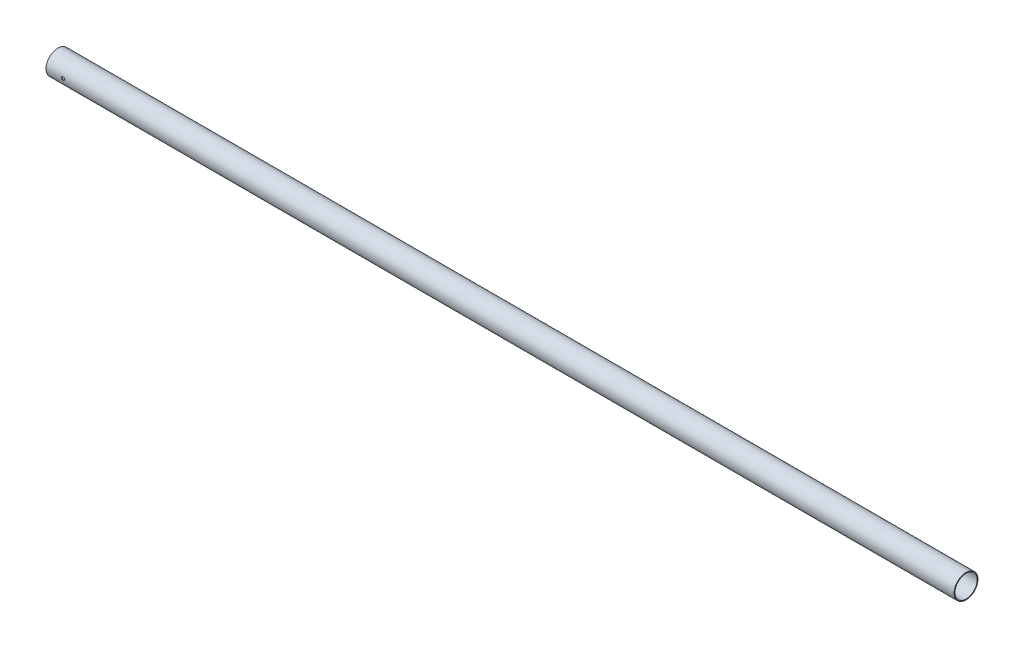
ISO-10303-21;
HEADER;
FILE_DESCRIPTION(('STEP AP214'),'2;1');
FILE_NAME('part.step','',(''),(''),'','','');
FILE_SCHEMA(('AUTOMOTIVE_DESIGN { 1 0 10303 214 1 1 1 1 }'));
ENDSEC;
DATA;
#1=APPLICATION_CONTEXT('core data for automotive mechanical design processes');
#2=APPLICATION_PROTOCOL_DEFINITION('international standard','automotive_design',2000,#1);
#3=PRODUCT_CONTEXT('',#1,'mechanical');
#4=PRODUCT('Part','Part','',(#3));
#5=PRODUCT_RELATED_PRODUCT_CATEGORY('part','',(#4));
#6=PRODUCT_DEFINITION_FORMATION('','',#4);
#7=PRODUCT_DEFINITION_CONTEXT('part definition',#1,'design');
#8=PRODUCT_DEFINITION('design','',#6,#7);
#9=PRODUCT_DEFINITION_SHAPE('','',#8);
#10=(LENGTH_UNIT() NAMED_UNIT(*) SI_UNIT(.MILLI.,.METRE.));
#11=(NAMED_UNIT(*) PLANE_ANGLE_UNIT() SI_UNIT($,.RADIAN.));
#12=(NAMED_UNIT(*) SI_UNIT($,.STERADIAN.) SOLID_ANGLE_UNIT());
#13=UNCERTAINTY_MEASURE_WITH_UNIT(LENGTH_MEASURE(1.E-05),#10,'distance_accuracy_value','');
#14=(GEOMETRIC_REPRESENTATION_CONTEXT(3) GLOBAL_UNCERTAINTY_ASSIGNED_CONTEXT((#13)) GLOBAL_UNIT_ASSIGNED_CONTEXT((#10,
#11,#12)) REPRESENTATION_CONTEXT('',''));
#15=CARTESIAN_POINT('',(0.,0.,0.));
#16=DIRECTION('',(0.,0.,1.));
#17=DIRECTION('',(1.,0.,0.));
#18=AXIS2_PLACEMENT_3D('',#15,#16,#17);
#19=CARTESIAN_POINT('',(965.67,0.,0.));
#20=DIRECTION('',(1.,0.,0.));
#21=DIRECTION('',(0.,0.,-1.));
#22=AXIS2_PLACEMENT_3D('',#19,#20,#21);
#23=PLANE('',#22);
#24=CARTESIAN_POINT('',(965.67,0.,0.));
#25=DIRECTION('',(1.,0.,0.));
#26=DIRECTION('',(0.,0.,-1.));
#27=AXIS2_PLACEMENT_3D('',#24,#25,#26);
#28=CIRCLE('',#27,12.7);
#29=CARTESIAN_POINT('',(965.67,0.,-12.7));
#30=VERTEX_POINT('',#29);
#31=EDGE_CURVE('E10',#30,#30,#28,.T.);
#32=ORIENTED_EDGE('',*,*,#31,.T.);
#33=EDGE_LOOP('',(#32));
#34=FACE_BOUND('',#33,.T.);
#35=CARTESIAN_POINT('',(965.67,0.,0.));
#36=DIRECTION('',(1.,0.,0.));
#37=DIRECTION('',(0.,0.,-1.));
#38=AXIS2_PLACEMENT_3D('',#35,#36,#37);
#39=CIRCLE('',#38,11.811);
#40=CARTESIAN_POINT('',(965.67,0.,-11.811));
#41=VERTEX_POINT('',#40);
#42=EDGE_CURVE('E56',#41,#41,#39,.T.);
#43=ORIENTED_EDGE('',*,*,#42,.F.);
#44=EDGE_LOOP('',(#43));
#45=FACE_BOUND('',#44,.T.);
#46=ADVANCED_FACE('F37',(#34,#45),#23,.T.);
#47=CARTESIAN_POINT('',(0.,0.,0.));
#48=DIRECTION('',(1.,0.,0.));
#49=DIRECTION('',(0.,0.,-1.));
#50=AXIS2_PLACEMENT_3D('',#47,#48,#49);
#51=PLANE('',#50);
#52=CARTESIAN_POINT('',(0.,0.,0.));
#53=DIRECTION('',(1.,0.,0.));
#54=DIRECTION('',(0.,0.,-1.));
#55=AXIS2_PLACEMENT_3D('',#52,#53,#54);
#56=CIRCLE('',#55,12.7);
#57=CARTESIAN_POINT('',(0.,0.,-12.7));
#58=VERTEX_POINT('',#57);
#59=EDGE_CURVE('E51',#58,#58,#56,.T.);
#60=ORIENTED_EDGE('',*,*,#59,.F.);
#61=EDGE_LOOP('',(#60));
#62=FACE_BOUND('',#61,.T.);
#63=CARTESIAN_POINT('',(0.,0.,0.));
#64=DIRECTION('',(1.,0.,0.));
#65=DIRECTION('',(0.,0.,-1.));
#66=AXIS2_PLACEMENT_3D('',#63,#64,#65);
#67=CIRCLE('',#66,11.811);
#68=CARTESIAN_POINT('',(0.,0.,-11.811));
#69=VERTEX_POINT('',#68);
#70=EDGE_CURVE('E59',#69,#69,#67,.T.);
#71=ORIENTED_EDGE('',*,*,#70,.T.);
#72=EDGE_LOOP('',(#71));
#73=FACE_BOUND('',#72,.T.);
#74=ADVANCED_FACE('F95',(#62,#73),#51,.F.);
#75=CARTESIAN_POINT('',(965.67,0.,0.));
#76=DIRECTION('',(-1.,0.,0.));
#77=DIRECTION('',(0.,0.,1.));
#78=AXIS2_PLACEMENT_3D('',#75,#76,#77);
#79=CYLINDRICAL_SURFACE('',#78,12.7);
#80=CARTESIAN_POINT('',(19.7,0.,-12.7));
#81=CARTESIAN_POINT('',(19.6999959992179,0.0950339668840666,-12.6999985995786));
#82=CARTESIAN_POINT('',(19.6920041882555,0.19012590693117,-12.69892205577));
#83=CARTESIAN_POINT('',(19.6602516928035,0.377659735515664,-12.6947310786922));
#84=CARTESIAN_POINT('',(19.6364749137547,0.470098818704447,-12.6916145654891));
#85=CARTESIAN_POINT('',(19.5738689603469,0.649585162895937,-12.6836944529743));
#86=CARTESIAN_POINT('',(19.5350503362114,0.736636153540407,-12.6788920363625));
#87=CARTESIAN_POINT('',(19.4434866282167,0.902972809326937,-12.668133083874));
#88=CARTESIAN_POINT('',(19.3907437804094,0.98225971848077,-12.6621767333452));
#89=CARTESIAN_POINT('',(19.2724752538047,1.13133074623819,-12.6497322350832));
#90=CARTESIAN_POINT('',(19.2068795471188,1.20105907920494,-12.6432412923369));
#91=CARTESIAN_POINT('',(19.0649178381758,1.32855287527093,-12.6304814917944));
#92=CARTESIAN_POINT('',(18.9885512647912,1.38631770360164,-12.6242126457971));
#93=CARTESIAN_POINT('',(18.8268487301552,1.48845585085959,-12.6125794864754));
#94=CARTESIAN_POINT('',(18.7414790965265,1.53277630674079,-12.6072187794791));
#95=CARTESIAN_POINT('',(18.5644244545483,1.60642994888796,-12.5980462279763));
#96=CARTESIAN_POINT('',(18.4727397204773,1.63576378559042,-12.5942343162519));
#97=CARTESIAN_POINT('',(18.2862392993217,1.67844067068208,-12.5886179602665));
#98=CARTESIAN_POINT('',(18.19144564102,1.69187839487359,-12.5868016351371));
#99=CARTESIAN_POINT('',(18.0009326732876,1.70267468090193,-12.5853458584028));
#100=CARTESIAN_POINT('',(17.9052134065726,1.70003398123825,-12.5857063068164));
#101=CARTESIAN_POINT('',(17.7162291334578,1.67882597900675,-12.5885524791077));
#102=CARTESIAN_POINT('',(17.6229521402506,1.66036334859318,-12.591024234991));
#103=CARTESIAN_POINT('',(17.4408322087313,1.60819906549934,-12.5977927233188));
#104=CARTESIAN_POINT('',(17.3519893722998,1.57449706285331,-12.6020894976741));
#105=CARTESIAN_POINT('',(17.180936742358,1.4926994268841,-12.6120395901206));
#106=CARTESIAN_POINT('',(17.0987487727502,1.44455869286377,-12.6176971476118));
#107=CARTESIAN_POINT('',(16.9435781710446,1.33528234667655,-12.6297281429156));
#108=CARTESIAN_POINT('',(16.8705960216702,1.27414605351568,-12.6361016182354));
#109=CARTESIAN_POINT('',(16.7353015027677,1.14003577368446,-12.6489082931571));
#110=CARTESIAN_POINT('',(16.673078463414,1.06697163981454,-12.655341565124));
#111=CARTESIAN_POINT('',(16.5617652939802,0.911389033566232,-12.6674957373912));
#112=CARTESIAN_POINT('',(16.5126752022542,0.828870533577836,-12.6732166356108));
#113=CARTESIAN_POINT('',(16.4290198450538,0.656649852468908,-12.6833057832175));
#114=CARTESIAN_POINT('',(16.3944606061958,0.566944709042034,-12.6876734711684));
#115=CARTESIAN_POINT('',(16.3409211232213,0.382932939657379,-12.6945591425037));
#116=CARTESIAN_POINT('',(16.3219400419676,0.288626561248753,-12.6970772252812));
#117=CARTESIAN_POINT('',(16.3002124588233,0.0988612499416711,-12.6999669678248));
#118=CARTESIAN_POINT('',(16.2973429834856,0.00341663518550021,-12.7003548857848));
#119=CARTESIAN_POINT('',(16.3075949092041,-0.186592199942903,-12.6989846078418));
#120=CARTESIAN_POINT('',(16.3207159184645,-0.281156441828657,-12.6972264645213));
#121=CARTESIAN_POINT('',(16.3624741566565,-0.466354124240493,-12.6917717046385));
#122=CARTESIAN_POINT('',(16.3910523228938,-0.557001118115943,-12.688082468612));
#123=CARTESIAN_POINT('',(16.4628519475053,-0.73221634230603,-12.6791782889493));
#124=CARTESIAN_POINT('',(16.5060739685466,-0.816784338893335,-12.6739632866891));
#125=CARTESIAN_POINT('',(16.6062288937945,-0.977987387725022,-12.6625478144558));
#126=CARTESIAN_POINT('',(16.6632408321252,-1.05457293223038,-12.6563417366426));
#127=CARTESIAN_POINT('',(16.7892460195627,-1.19713236803618,-12.6436547701942));
#128=CARTESIAN_POINT('',(16.8582398170769,-1.26310577335476,-12.6371738689908));
#129=CARTESIAN_POINT('',(17.006793907203,-1.38300824178855,-12.6246170593813));
#130=CARTESIAN_POINT('',(17.0864205322927,-1.43685547455966,-12.6185440858799));
#131=CARTESIAN_POINT('',(17.2536601808562,-1.53041060066335,-12.607540272347));
#132=CARTESIAN_POINT('',(17.3412730247706,-1.57011881179429,-12.6026094066456));
#133=CARTESIAN_POINT('',(17.5217407781579,-1.63413811770883,-12.5944685488549));
#134=CARTESIAN_POINT('',(17.6145794495971,-1.65849431867464,-12.5912535197242));
#135=CARTESIAN_POINT('',(17.8030751011367,-1.69126295280576,-12.5868942723901));
#136=CARTESIAN_POINT('',(17.8987319289187,-1.69967624606926,-12.5857499424755));
#137=CARTESIAN_POINT('',(18.0893339863174,-1.70030289341542,-12.5856652315807));
#138=CARTESIAN_POINT('',(18.1842788108431,-1.69264483293011,-12.5867073569543));
#139=CARTESIAN_POINT('',(18.3715183834309,-1.66161953930401,-12.5908403897388));
#140=CARTESIAN_POINT('',(18.463813132574,-1.6382523125708,-12.593931296314));
#141=CARTESIAN_POINT('',(18.6431094231047,-1.57651400196732,-12.601807977421));
#142=CARTESIAN_POINT('',(18.7301134601321,-1.53815005652329,-12.6065929454788));
#143=CARTESIAN_POINT('',(18.8964702488958,-1.44751995832389,-12.6173198076024));
#144=CARTESIAN_POINT('',(18.9758228494986,-1.39525353103899,-12.6232617245136));
#145=CARTESIAN_POINT('',(19.1252803268485,-1.27782820548912,-12.6356898389152));
#146=CARTESIAN_POINT('',(19.1953097247303,-1.21257363471889,-12.6421798563099));
#147=CARTESIAN_POINT('',(19.3234721297044,-1.07122538659935,-12.6549397826002));
#148=CARTESIAN_POINT('',(19.3816023430478,-0.995129170891949,-12.6612096395197));
#149=CARTESIAN_POINT('',(19.48453599194,-0.833873629090083,-12.6728533752327));
#150=CARTESIAN_POINT('',(19.5292802962862,-0.748676282109283,-12.6782232337741));
#151=CARTESIAN_POINT('',(19.6037608892282,-0.571949691102355,-12.6874217828558));
#152=CARTESIAN_POINT('',(19.63351323197,-0.48042734019212,-12.6912521210983));
#153=CARTESIAN_POINT('',(19.6701668573837,-0.32370968364222,-12.6960329483211));
#154=CARTESIAN_POINT('',(19.6813378724772,-0.259496143043121,-12.6975132154494));
#155=CARTESIAN_POINT('',(19.6962557812401,-0.130197467850004,-12.6994972166818));
#156=CARTESIAN_POINT('',(19.7000027411282,-0.0651123410353023,-12.700000959496));
#157=CARTESIAN_POINT('',(19.7,0.,-12.7));
#158=B_SPLINE_CURVE_WITH_KNOTS('',3,(#80,#81,#82,#83,#84,#85,#86,#87,#88,#89,#90,#91,#92,#93,
#94,#95,#96,#97,#98,#99,#100,#101,#102,#103,#104,#105,#106,#107,#108,#109,#110,#111,#112,#113,
#114,#115,#116,#117,#118,#119,#120,#121,#122,#123,#124,#125,#126,#127,#128,#129,#130,#131,#132,
#133,#134,#135,#136,#137,#138,#139,#140,#141,#142,#143,#144,#145,#146,#147,#148,#149,#150,#151,
#152,#153,#154,#155,#156,#157),.UNSPECIFIED.,.T.,.F.,(4,2,2,2,2,2,2,2,2,2,2,2,2,2,2,2,2,2,2,2,2,
2,2,2,2,2,2,2,2,2,2,2,2,2,2,2,2,2,4),(0.,0.284864035698537,0.570018969485685,0.854974258980744,
1.13988381611715,1.42639115813427,1.71291369797885,2.00054865692536,2.28817113112365,
2.57407178612564,2.85995930949888,3.14396997780514,3.42798716862777,3.71290091962872,
3.99782960437716,4.28502088941334,4.57221301316844,4.85952413156251,5.14681980945722,
5.43191966224501,5.71701252971187,6.00102365831222,6.28504570083371,6.57073582475008,
6.8564390280948,7.14401601038438,7.431586528488,7.71830813986012,8.0050142825509,
8.28943526420126,8.57385612983972,8.85814177590334,9.14243303611576,9.42890156631939,
9.71543727805735,10.0032206578249,10.290695206261,10.4858709975236,10.6810450479105),.UNSPECIFIED.);
#159=CARTESIAN_POINT('',(19.7,0.,-12.7));
#160=VERTEX_POINT('',#159);
#161=EDGE_CURVE('E84',#160,#160,#158,.T.);
#162=ORIENTED_EDGE('',*,*,#161,.T.);
#163=EDGE_LOOP('',(#162));
#164=FACE_BOUND('',#163,.T.);
#165=CARTESIAN_POINT('',(19.7,0.,12.7));
#166=CARTESIAN_POINT('',(19.6999959992179,-0.0950339668840666,12.6999985995786));
#167=CARTESIAN_POINT('',(19.6920041882555,-0.19012590693117,12.69892205577));
#168=CARTESIAN_POINT('',(19.6602516928035,-0.377659735515664,12.6947310786922));
#169=CARTESIAN_POINT('',(19.6364749137547,-0.470098818704447,12.6916145654891));
#170=CARTESIAN_POINT('',(19.5738689603469,-0.649585162895937,12.6836944529743));
#171=CARTESIAN_POINT('',(19.5350503362114,-0.736636153540407,12.6788920363625));
#172=CARTESIAN_POINT('',(19.4434866282167,-0.902972809326937,12.668133083874));
#173=CARTESIAN_POINT('',(19.3907437804094,-0.98225971848077,12.6621767333452));
#174=CARTESIAN_POINT('',(19.2724752538047,-1.13133074623819,12.6497322350832));
#175=CARTESIAN_POINT('',(19.2068795471188,-1.20105907920494,12.6432412923369));
#176=CARTESIAN_POINT('',(19.0649178381758,-1.32855287527093,12.6304814917944));
#177=CARTESIAN_POINT('',(18.9885512647912,-1.38631770360164,12.6242126457971));
#178=CARTESIAN_POINT('',(18.8268487301552,-1.48845585085959,12.6125794864754));
#179=CARTESIAN_POINT('',(18.7414790965265,-1.53277630674079,12.6072187794791));
#180=CARTESIAN_POINT('',(18.5644244545483,-1.60642994888796,12.5980462279763));
#181=CARTESIAN_POINT('',(18.4727397204773,-1.63576378559042,12.5942343162519));
#182=CARTESIAN_POINT('',(18.2862392993217,-1.67844067068208,12.5886179602665));
#183=CARTESIAN_POINT('',(18.19144564102,-1.69187839487359,12.5868016351371));
#184=CARTESIAN_POINT('',(18.0009326732876,-1.70267468090193,12.5853458584028));
#185=CARTESIAN_POINT('',(17.9052134065726,-1.70003398123825,12.5857063068164));
#186=CARTESIAN_POINT('',(17.7162291334578,-1.67882597900675,12.5885524791077));
#187=CARTESIAN_POINT('',(17.6229521402506,-1.66036334859318,12.591024234991));
#188=CARTESIAN_POINT('',(17.4408322087313,-1.60819906549934,12.5977927233188));
#189=CARTESIAN_POINT('',(17.3519893722998,-1.57449706285331,12.6020894976741));
#190=CARTESIAN_POINT('',(17.180936742358,-1.4926994268841,12.6120395901206));
#191=CARTESIAN_POINT('',(17.0987487727502,-1.44455869286377,12.6176971476118));
#192=CARTESIAN_POINT('',(16.9435781710446,-1.33528234667655,12.6297281429156));
#193=CARTESIAN_POINT('',(16.8705960216702,-1.27414605351568,12.6361016182354));
#194=CARTESIAN_POINT('',(16.7353015027677,-1.14003577368446,12.6489082931571));
#195=CARTESIAN_POINT('',(16.673078463414,-1.06697163981454,12.655341565124));
#196=CARTESIAN_POINT('',(16.5617652939802,-0.911389033566232,12.6674957373912));
#197=CARTESIAN_POINT('',(16.5126752022542,-0.828870533577836,12.6732166356108));
#198=CARTESIAN_POINT('',(16.4290198450538,-0.656649852468908,12.6833057832175));
#199=CARTESIAN_POINT('',(16.3944606061958,-0.566944709042034,12.6876734711684));
#200=CARTESIAN_POINT('',(16.3409211232213,-0.382932939657379,12.6945591425037));
#201=CARTESIAN_POINT('',(16.3219400419676,-0.288626561248753,12.6970772252812));
#202=CARTESIAN_POINT('',(16.3002124588233,-0.0988612499416711,12.6999669678248));
#203=CARTESIAN_POINT('',(16.2973429834856,-0.00341663518550021,12.7003548857848));
#204=CARTESIAN_POINT('',(16.3075949092041,0.186592199942903,12.6989846078418));
#205=CARTESIAN_POINT('',(16.3207159184645,0.281156441828657,12.6972264645213));
#206=CARTESIAN_POINT('',(16.3624741566565,0.466354124240493,12.6917717046385));
#207=CARTESIAN_POINT('',(16.3910523228938,0.557001118115943,12.688082468612));
#208=CARTESIAN_POINT('',(16.4628519475053,0.73221634230603,12.6791782889493));
#209=CARTESIAN_POINT('',(16.5060739685466,0.816784338893335,12.6739632866891));
#210=CARTESIAN_POINT('',(16.6062288937945,0.977987387725022,12.6625478144558));
#211=CARTESIAN_POINT('',(16.6632408321252,1.05457293223038,12.6563417366426));
#212=CARTESIAN_POINT('',(16.7892460195627,1.19713236803618,12.6436547701942));
#213=CARTESIAN_POINT('',(16.8582398170769,1.26310577335476,12.6371738689908));
#214=CARTESIAN_POINT('',(17.006793907203,1.38300824178855,12.6246170593813));
#215=CARTESIAN_POINT('',(17.0864205322927,1.43685547455966,12.6185440858799));
#216=CARTESIAN_POINT('',(17.2536601808562,1.53041060066335,12.607540272347));
#217=CARTESIAN_POINT('',(17.3412730247706,1.57011881179429,12.6026094066456));
#218=CARTESIAN_POINT('',(17.5217407781579,1.63413811770883,12.5944685488549));
#219=CARTESIAN_POINT('',(17.6145794495971,1.65849431867464,12.5912535197242));
#220=CARTESIAN_POINT('',(17.8030751011367,1.69126295280576,12.5868942723901));
#221=CARTESIAN_POINT('',(17.8987319289187,1.69967624606926,12.5857499424755));
#222=CARTESIAN_POINT('',(18.0893339863174,1.70030289341542,12.5856652315807));
#223=CARTESIAN_POINT('',(18.1842788108431,1.69264483293011,12.5867073569543));
#224=CARTESIAN_POINT('',(18.3715183834309,1.66161953930401,12.5908403897388));
#225=CARTESIAN_POINT('',(18.463813132574,1.6382523125708,12.593931296314));
#226=CARTESIAN_POINT('',(18.6431094231047,1.57651400196732,12.601807977421));
#227=CARTESIAN_POINT('',(18.7301134601321,1.53815005652329,12.6065929454788));
#228=CARTESIAN_POINT('',(18.8964702488958,1.44751995832389,12.6173198076024));
#229=CARTESIAN_POINT('',(18.9758228494986,1.39525353103899,12.6232617245136));
#230=CARTESIAN_POINT('',(19.1252803268485,1.27782820548912,12.6356898389152));
#231=CARTESIAN_POINT('',(19.1953097247303,1.21257363471889,12.6421798563099));
#232=CARTESIAN_POINT('',(19.3234721297044,1.07122538659935,12.6549397826002));
#233=CARTESIAN_POINT('',(19.3816023430478,0.995129170891949,12.6612096395197));
#234=CARTESIAN_POINT('',(19.48453599194,0.833873629090083,12.6728533752327));
#235=CARTESIAN_POINT('',(19.5292802962862,0.748676282109283,12.6782232337741));
#236=CARTESIAN_POINT('',(19.6037608892282,0.571949691102355,12.6874217828558));
#237=CARTESIAN_POINT('',(19.63351323197,0.48042734019212,12.6912521210983));
#238=CARTESIAN_POINT('',(19.6701668573837,0.32370968364222,12.6960329483211));
#239=CARTESIAN_POINT('',(19.6813378724772,0.259496143043121,12.6975132154494));
#240=CARTESIAN_POINT('',(19.6962557812401,0.130197467850004,12.6994972166818));
#241=CARTESIAN_POINT('',(19.7000027411282,0.0651123410353023,12.700000959496));
#242=CARTESIAN_POINT('',(19.7,0.,12.7));
#243=B_SPLINE_CURVE_WITH_KNOTS('',3,(#165,#166,#167,#168,#169,#170,#171,#172,#173,#174,#175,
#176,#177,#178,#179,#180,#181,#182,#183,#184,#185,#186,#187,#188,#189,#190,#191,#192,#193,#194,
#195,#196,#197,#198,#199,#200,#201,#202,#203,#204,#205,#206,#207,#208,#209,#210,#211,#212,#213,
#214,#215,#216,#217,#218,#219,#220,#221,#222,#223,#224,#225,#226,#227,#228,#229,#230,#231,#232,
#233,#234,#235,#236,#237,#238,#239,#240,#241,#242),.UNSPECIFIED.,.T.,.F.,(4,2,2,2,2,2,2,2,2,2,2,
2,2,2,2,2,2,2,2,2,2,2,2,2,2,2,2,2,2,2,2,2,2,2,2,2,2,2,4),(0.,0.284864035698537,
0.570018969485685,0.854974258980744,1.13988381611715,1.42639115813427,1.71291369797885,
2.00054865692536,2.28817113112365,2.57407178612564,2.85995930949888,3.14396997780514,
3.42798716862777,3.71290091962872,3.99782960437716,4.28502088941334,4.57221301316844,
4.85952413156251,5.14681980945722,5.43191966224501,5.71701252971187,6.00102365831222,
6.28504570083371,6.57073582475008,6.8564390280948,7.14401601038438,7.431586528488,
7.71830813986012,8.0050142825509,8.28943526420126,8.57385612983972,8.85814177590334,
9.14243303611576,9.42890156631939,9.71543727805735,10.0032206578249,10.290695206261,
10.4858709975236,10.6810450479105),.UNSPECIFIED.);
#244=CARTESIAN_POINT('',(19.7,0.,12.7));
#245=VERTEX_POINT('',#244);
#246=EDGE_CURVE('E79',#245,#245,#243,.T.);
#247=ORIENTED_EDGE('',*,*,#246,.T.);
#248=EDGE_LOOP('',(#247));
#249=FACE_BOUND('',#248,.T.);
#250=ORIENTED_EDGE('',*,*,#31,.F.);
#251=EDGE_LOOP('',(#250));
#252=FACE_BOUND('',#251,.T.);
#253=ORIENTED_EDGE('',*,*,#59,.T.);
#254=EDGE_LOOP('',(#253));
#255=FACE_BOUND('',#254,.T.);
#256=ADVANCED_FACE('F39',(#164,#249,#252,#255),#79,.T.);
#257=CARTESIAN_POINT('',(965.67,0.,0.));
#258=DIRECTION('',(-1.,0.,0.));
#259=DIRECTION('',(0.,0.,1.));
#260=AXIS2_PLACEMENT_3D('',#257,#258,#259);
#261=CYLINDRICAL_SURFACE('',#260,11.811);
#262=CARTESIAN_POINT('',(19.7,0.,11.811));
#263=CARTESIAN_POINT('',(19.6999960506825,-0.0949633365740569,11.8109985219341));
#264=CARTESIAN_POINT('',(19.6920160552475,-0.189982877219708,11.8098426802892));
#265=CARTESIAN_POINT('',(19.6603132495635,-0.377369093460647,11.8053430227354));
#266=CARTESIAN_POINT('',(19.6365748230488,-0.469733042599291,11.8019970364864));
#267=CARTESIAN_POINT('',(19.5740765633508,-0.649068854078001,11.7934933444568));
#268=CARTESIAN_POINT('',(19.5353277640509,-0.736044622835741,11.7883369697238));
#269=CARTESIAN_POINT('',(19.4439349591902,-0.902245224987233,11.7767832373071));
#270=CARTESIAN_POINT('',(19.3912930000878,-0.981471197569839,11.7703860624296));
#271=CARTESIAN_POINT('',(19.2732030959118,-1.13050913396133,11.7570112315331));
#272=CARTESIAN_POINT('',(19.2076747326008,-1.20025707309759,11.7500300971524));
#273=CARTESIAN_POINT('',(19.0658451220361,-1.32780690367162,11.7363015989273));
#274=CARTESIAN_POINT('',(18.9895432747015,-1.3856081292376,11.7295542481307));
#275=CARTESIAN_POINT('',(18.8279058995033,-1.48787036847237,11.7170234438705));
#276=CARTESIAN_POINT('',(18.7425311085024,-1.53226992046287,11.7112444838184));
#277=CARTESIAN_POINT('',(18.5654391933575,-1.60607577266456,11.7013519190154));
#278=CARTESIAN_POINT('',(18.473722387587,-1.6354828248897,11.6972382307377));
#279=CARTESIAN_POINT('',(18.287221238183,-1.67827112473676,11.6911759676832));
#280=CARTESIAN_POINT('',(18.1924624498631,-1.69176163203234,11.6892126384495));
#281=CARTESIAN_POINT('',(18.0020072490258,-1.70267227309994,11.6876285186793));
#282=CARTESIAN_POINT('',(17.9063108864093,-1.70009325756097,11.6880076041401));
#283=CARTESIAN_POINT('',(17.7174661214855,-1.67902745255736,11.691051985365));
#284=CARTESIAN_POINT('',(17.6243038621422,-1.66066200271549,11.693699842128));
#285=CARTESIAN_POINT('',(17.4423972032276,-1.60873443984952,11.7009561911545));
#286=CARTESIAN_POINT('',(17.3536529196023,-1.57517192822512,11.7055647348442));
#287=CARTESIAN_POINT('',(17.1827301433947,-1.49367567025867,11.716242590323));
#288=CARTESIAN_POINT('',(17.1005766614923,-1.44569018392096,11.7223171454555));
#289=CARTESIAN_POINT('',(16.9454419332378,-1.33674699740009,11.7352387233349));
#290=CARTESIAN_POINT('',(16.8724612422249,-1.27578851240678,11.7420857928038));
#291=CARTESIAN_POINT('',(16.7370402316378,-1.14196200077654,11.7558580883074));
#292=CARTESIAN_POINT('',(16.6747030446548,-1.06898958032788,11.7627834539105));
#293=CARTESIAN_POINT('',(16.5631449214485,-0.913563355066816,11.7758734292219));
#294=CARTESIAN_POINT('',(16.5139240347357,-0.831109514466287,11.7820380360584));
#295=CARTESIAN_POINT('',(16.4299917699311,-0.658974172014321,11.7929176287989));
#296=CARTESIAN_POINT('',(16.3952879602131,-0.569288929110842,11.7976318582212));
#297=CARTESIAN_POINT('',(16.3414625975828,-0.385280648300725,11.8050730910877));
#298=CARTESIAN_POINT('',(16.3223400754528,-0.290957899252374,11.8078002181366));
#299=CARTESIAN_POINT('',(16.3003563446372,-0.101242607019846,11.8109436834614));
#300=CARTESIAN_POINT('',(16.2973532771797,-0.00586682355212268,11.811380179601));
#301=CARTESIAN_POINT('',(16.3073177263595,0.184026880290368,11.8099479582115));
#302=CARTESIAN_POINT('',(16.3202847888428,0.278544824983108,11.8080793062356));
#303=CARTESIAN_POINT('',(16.3617034710758,0.463613016155271,11.8022592312506));
#304=CARTESIAN_POINT('',(16.3900863585206,0.554178960795697,11.7983170556067));
#305=CARTESIAN_POINT('',(16.4614587888451,0.729266418257608,11.7887906933605));
#306=CARTESIAN_POINT('',(16.5044489700626,0.813787666730863,11.7832064350008));
#307=CARTESIAN_POINT('',(16.6041511523142,0.975012812185227,11.7709668100829));
#308=CARTESIAN_POINT('',(16.6609536014292,1.05166023789249,11.7643044843033));
#309=CARTESIAN_POINT('',(16.7865414587591,1.19438484899554,11.750672986933));
#310=CARTESIAN_POINT('',(16.8553275054601,1.26046147081892,11.7437037990075));
#311=CARTESIAN_POINT('',(17.003559830618,1.38068166669794,11.7301805683755));
#312=CARTESIAN_POINT('',(17.0830833909513,1.43473041373841,11.7236300961746));
#313=CARTESIAN_POINT('',(17.2501637244195,1.52870253161708,11.7117480571151));
#314=CARTESIAN_POINT('',(17.3377202942297,1.56862625985151,11.7064164594173));
#315=CARTESIAN_POINT('',(17.5180924831322,1.6330663713551,11.6976013208194));
#316=CARTESIAN_POINT('',(17.6108896352666,1.6576335753935,11.6941116901567));
#317=CARTESIAN_POINT('',(17.7993464367159,1.69082554924417,11.6893590853919));
#318=CARTESIAN_POINT('',(17.8950059049259,1.6994513255461,11.6880959707151));
#319=CARTESIAN_POINT('',(18.0855272553967,1.70049305790303,11.6879443741982));
#320=CARTESIAN_POINT('',(18.180388339111,1.69305807386296,11.6890340560121));
#321=CARTESIAN_POINT('',(18.3674964573984,1.66250778747196,11.6934179490026));
#322=CARTESIAN_POINT('',(18.4597434948784,1.63939250255821,11.6967121577278));
#323=CARTESIAN_POINT('',(18.6389692279335,1.57818894246534,11.7051265233326));
#324=CARTESIAN_POINT('',(18.7259512568652,1.54011025772638,11.7102455104686));
#325=CARTESIAN_POINT('',(18.8923159801059,1.45007554750406,11.7217341938223));
#326=CARTESIAN_POINT('',(18.9716984583745,1.39811912766296,11.7281039255805));
#327=CARTESIAN_POINT('',(19.1213693369344,1.2812591410815,11.7414469050402));
#328=CARTESIAN_POINT('',(19.1915709499774,1.2162449615365,11.7484249990409));
#329=CARTESIAN_POINT('',(19.3201216216477,1.07534846350219,11.7621573750622));
#330=CARTESIAN_POINT('',(19.3784679127108,0.999463614343984,11.7689116045154));
#331=CARTESIAN_POINT('',(19.4819122735376,0.83853133913813,11.7814739265501));
#332=CARTESIAN_POINT('',(19.5269419649513,0.753439585305897,11.787277069854));
#333=CARTESIAN_POINT('',(19.6020042533168,0.576859476383486,11.7972345527272));
#334=CARTESIAN_POINT('',(19.632052581816,0.485377946647713,11.801390620903));
#335=CARTESIAN_POINT('',(19.6693842114288,0.327890845246801,11.8066231007302));
#336=CARTESIAN_POINT('',(19.680847861636,0.262863239839553,11.8082561218876));
#337=CARTESIAN_POINT('',(19.6961570856845,0.131899455682025,11.8104450789484));
#338=CARTESIAN_POINT('',(19.7000027432689,0.0659632869274253,11.8110010266919));
#339=CARTESIAN_POINT('',(19.7,0.,11.811));
#340=B_SPLINE_CURVE_WITH_KNOTS('',3,(#262,#263,#264,#265,#266,#267,#268,#269,#270,#271,#272,
#273,#274,#275,#276,#277,#278,#279,#280,#281,#282,#283,#284,#285,#286,#287,#288,#289,#290,#291,
#292,#293,#294,#295,#296,#297,#298,#299,#300,#301,#302,#303,#304,#305,#306,#307,#308,#309,#310,
#311,#312,#313,#314,#315,#316,#317,#318,#319,#320,#321,#322,#323,#324,#325,#326,#327,#328,#329,
#330,#331,#332,#333,#334,#335,#336,#337,#338,#339),.UNSPECIFIED.,.T.,.F.,(4,2,2,2,2,2,2,2,2,2,2,
2,2,2,2,2,2,2,2,2,2,2,2,2,2,2,2,2,2,2,2,2,2,2,2,2,2,2,4),(0.,0.284648997756756,
0.569580498473071,0.854302946868714,1.13898347911696,1.42550042768716,1.71203334149623,
1.99986103307518,2.2876742859853,2.5735001221883,2.85931082746098,3.14294414558129,
3.42658490348702,3.711255571745,3.9959434662417,4.28325010816804,4.570557834584,
4.85801516070151,5.1454546044716,5.43036024797864,5.71525778960857,5.9988954041135,
6.28254541515722,6.56810541339531,6.85368063092428,7.14143326657706,7.42917862088989,
7.71596659993671,8.00273647150893,8.28685627476276,8.57097576206354,8.8549134458757,
9.13885919908395,9.4253202309991,9.71184805913824,9.99982258064417,10.287494067183,
10.4852186901637,10.6829411395849),.UNSPECIFIED.);
#341=CARTESIAN_POINT('',(19.7,0.,11.811));
#342=VERTEX_POINT('',#341);
#343=EDGE_CURVE('E42',#342,#342,#340,.T.);
#344=ORIENTED_EDGE('',*,*,#343,.F.);
#345=EDGE_LOOP('',(#344));
#346=FACE_BOUND('',#345,.T.);
#347=CARTESIAN_POINT('',(19.7,0.,-11.811));
#348=CARTESIAN_POINT('',(19.6999960506825,0.0949633365740576,-11.8109985219341));
#349=CARTESIAN_POINT('',(19.6920160552475,0.189982877219709,-11.8098426802892));
#350=CARTESIAN_POINT('',(19.6603132495635,0.377369093460649,-11.8053430227354));
#351=CARTESIAN_POINT('',(19.6365748230488,0.469733042599292,-11.8019970364864));
#352=CARTESIAN_POINT('',(19.5740765633508,0.649068854078,-11.7934933444568));
#353=CARTESIAN_POINT('',(19.5353277640509,0.736044622835739,-11.7883369697238));
#354=CARTESIAN_POINT('',(19.4439349591902,0.902245224987231,-11.7767832373071));
#355=CARTESIAN_POINT('',(19.3912930000878,0.981471197569838,-11.7703860624296));
#356=CARTESIAN_POINT('',(19.2732030959118,1.13050913396133,-11.7570112315331));
#357=CARTESIAN_POINT('',(19.2076747326008,1.20025707309759,-11.7500300971524));
#358=CARTESIAN_POINT('',(19.0658451220361,1.32780690367162,-11.7363015989273));
#359=CARTESIAN_POINT('',(18.9895432747015,1.3856081292376,-11.7295542481307));
#360=CARTESIAN_POINT('',(18.8279058995033,1.48787036847237,-11.7170234438705));
#361=CARTESIAN_POINT('',(18.7425311085024,1.53226992046287,-11.7112444838184));
#362=CARTESIAN_POINT('',(18.5654391933575,1.60607577266456,-11.7013519190154));
#363=CARTESIAN_POINT('',(18.473722387587,1.6354828248897,-11.6972382307377));
#364=CARTESIAN_POINT('',(18.287221238183,1.67827112473676,-11.6911759676832));
#365=CARTESIAN_POINT('',(18.1924624498631,1.69176163203234,-11.6892126384495));
#366=CARTESIAN_POINT('',(18.0020072490258,1.70267227309994,-11.6876285186793));
#367=CARTESIAN_POINT('',(17.9063108864093,1.70009325756097,-11.6880076041401));
#368=CARTESIAN_POINT('',(17.7174661214855,1.67902745255736,-11.691051985365));
#369=CARTESIAN_POINT('',(17.6243038621422,1.66066200271549,-11.693699842128));
#370=CARTESIAN_POINT('',(17.4423972032276,1.60873443984952,-11.7009561911545));
#371=CARTESIAN_POINT('',(17.3536529196023,1.57517192822512,-11.7055647348442));
#372=CARTESIAN_POINT('',(17.1827301433947,1.49367567025867,-11.716242590323));
#373=CARTESIAN_POINT('',(17.1005766614923,1.44569018392096,-11.7223171454555));
#374=CARTESIAN_POINT('',(16.9454419332378,1.33674699740009,-11.7352387233349));
#375=CARTESIAN_POINT('',(16.8724612422249,1.27578851240678,-11.7420857928038));
#376=CARTESIAN_POINT('',(16.7370402316378,1.14196200077654,-11.7558580883074));
#377=CARTESIAN_POINT('',(16.6747030446548,1.06898958032788,-11.7627834539105));
#378=CARTESIAN_POINT('',(16.5631449214485,0.913563355066816,-11.7758734292219));
#379=CARTESIAN_POINT('',(16.5139240347357,0.831109514466287,-11.7820380360584));
#380=CARTESIAN_POINT('',(16.4299917699311,0.658974172014321,-11.7929176287989));
#381=CARTESIAN_POINT('',(16.3952879602131,0.569288929110842,-11.7976318582212));
#382=CARTESIAN_POINT('',(16.3414625975828,0.385280648300726,-11.8050730910877));
#383=CARTESIAN_POINT('',(16.3223400754528,0.290957899252374,-11.8078002181366));
#384=CARTESIAN_POINT('',(16.3003563446372,0.101242607019846,-11.8109436834614));
#385=CARTESIAN_POINT('',(16.2973532771797,0.00586682355212304,-11.811380179601));
#386=CARTESIAN_POINT('',(16.3073177263595,-0.184026880290368,-11.8099479582115));
#387=CARTESIAN_POINT('',(16.3202847888428,-0.278544824983107,-11.8080793062356));
#388=CARTESIAN_POINT('',(16.3617034710758,-0.463613016155271,-11.8022592312506));
#389=CARTESIAN_POINT('',(16.3900863585206,-0.554178960795696,-11.7983170556067));
#390=CARTESIAN_POINT('',(16.4614587888451,-0.729266418257607,-11.7887906933605));
#391=CARTESIAN_POINT('',(16.5044489700626,-0.813787666730862,-11.7832064350008));
#392=CARTESIAN_POINT('',(16.6041511523142,-0.975012812185226,-11.770966810083));
#393=CARTESIAN_POINT('',(16.6609536014292,-1.05166023789249,-11.7643044843033));
#394=CARTESIAN_POINT('',(16.7865414587591,-1.19438484899554,-11.750672986933));
#395=CARTESIAN_POINT('',(16.8553275054601,-1.26046147081892,-11.7437037990075));
#396=CARTESIAN_POINT('',(17.003559830618,-1.38068166669794,-11.7301805683755));
#397=CARTESIAN_POINT('',(17.0830833909513,-1.43473041373841,-11.7236300961746));
#398=CARTESIAN_POINT('',(17.2501637244195,-1.52870253161708,-11.7117480571151));
#399=CARTESIAN_POINT('',(17.3377202942297,-1.56862625985151,-11.7064164594173));
#400=CARTESIAN_POINT('',(17.5180924831322,-1.6330663713551,-11.6976013208194));
#401=CARTESIAN_POINT('',(17.6108896352666,-1.6576335753935,-11.6941116901567));
#402=CARTESIAN_POINT('',(17.7993464367159,-1.69082554924417,-11.6893590853919));
#403=CARTESIAN_POINT('',(17.8950059049259,-1.6994513255461,-11.6880959707151));
#404=CARTESIAN_POINT('',(18.0855272553967,-1.70049305790303,-11.6879443741982));
#405=CARTESIAN_POINT('',(18.180388339111,-1.69305807386296,-11.6890340560121));
#406=CARTESIAN_POINT('',(18.3674964573984,-1.66250778747196,-11.6934179490026));
#407=CARTESIAN_POINT('',(18.4597434948784,-1.63939250255821,-11.6967121577278));
#408=CARTESIAN_POINT('',(18.6389692279335,-1.57818894246534,-11.7051265233326));
#409=CARTESIAN_POINT('',(18.7259512568652,-1.54011025772638,-11.7102455104686));
#410=CARTESIAN_POINT('',(18.8923159801059,-1.45007554750406,-11.7217341938223));
#411=CARTESIAN_POINT('',(18.9716984583745,-1.39811912766296,-11.7281039255805));
#412=CARTESIAN_POINT('',(19.1213693369344,-1.2812591410815,-11.7414469050402));
#413=CARTESIAN_POINT('',(19.1915709499774,-1.2162449615365,-11.7484249990409));
#414=CARTESIAN_POINT('',(19.3201216216477,-1.07534846350219,-11.7621573750622));
#415=CARTESIAN_POINT('',(19.3784679127108,-0.999463614343984,-11.7689116045154));
#416=CARTESIAN_POINT('',(19.4819122735376,-0.83853133913813,-11.7814739265501));
#417=CARTESIAN_POINT('',(19.5269419649513,-0.753439585305898,-11.787277069854));
#418=CARTESIAN_POINT('',(19.6020042533168,-0.576859476383486,-11.7972345527272));
#419=CARTESIAN_POINT('',(19.632052581816,-0.485377946647713,-11.801390620903));
#420=CARTESIAN_POINT('',(19.6693842114288,-0.327890845246802,-11.8066231007302));
#421=CARTESIAN_POINT('',(19.680847861636,-0.262863239839554,-11.8082561218876));
#422=CARTESIAN_POINT('',(19.6961570856845,-0.131899455682027,-11.8104450789484));
#423=CARTESIAN_POINT('',(19.7000027432689,-0.065963286927426,-11.8110010266919));
#424=CARTESIAN_POINT('',(19.7,0.,-11.811));
#425=B_SPLINE_CURVE_WITH_KNOTS('',3,(#347,#348,#349,#350,#351,#352,#353,#354,#355,#356,#357,
#358,#359,#360,#361,#362,#363,#364,#365,#366,#367,#368,#369,#370,#371,#372,#373,#374,#375,#376,
#377,#378,#379,#380,#381,#382,#383,#384,#385,#386,#387,#388,#389,#390,#391,#392,#393,#394,#395,
#396,#397,#398,#399,#400,#401,#402,#403,#404,#405,#406,#407,#408,#409,#410,#411,#412,#413,#414,
#415,#416,#417,#418,#419,#420,#421,#422,#423,#424),.UNSPECIFIED.,.T.,.F.,(4,2,2,2,2,2,2,2,2,2,2,
2,2,2,2,2,2,2,2,2,2,2,2,2,2,2,2,2,2,2,2,2,2,2,2,2,2,2,4),(0.,0.284648997756756,0.56958049847307,
0.85430294686871,1.13898347911695,1.42550042768716,1.71203334149623,1.99986103307517,
2.2876742859853,2.57350012218829,2.85931082746098,3.14294414558129,3.42658490348701,
3.711255571745,3.9959434662417,4.28325010816803,4.570557834584,4.85801516070151,
5.14545460447159,5.43036024797864,5.71525778960856,5.9988954041135,6.28254541515722,
6.56810541339531,6.85368063092427,7.14143326657706,7.42917862088989,7.7159665999367,
8.00273647150893,8.28685627476276,8.57097576206353,8.8549134458757,9.13885919908395,
9.4253202309991,9.71184805913824,9.99982258064417,10.287494067183,10.4852186901637,
10.6829411395849),.UNSPECIFIED.);
#426=CARTESIAN_POINT('',(19.7,0.,-11.811));
#427=VERTEX_POINT('',#426);
#428=EDGE_CURVE('E61',#427,#427,#425,.T.);
#429=ORIENTED_EDGE('',*,*,#428,.F.);
#430=EDGE_LOOP('',(#429));
#431=FACE_BOUND('',#430,.T.);
#432=ORIENTED_EDGE('',*,*,#42,.T.);
#433=EDGE_LOOP('',(#432));
#434=FACE_BOUND('',#433,.T.);
#435=ORIENTED_EDGE('',*,*,#70,.F.);
#436=EDGE_LOOP('',(#435));
#437=FACE_BOUND('',#436,.T.);
#438=ADVANCED_FACE('F66',(#346,#431,#434,#437),#261,.F.);
#439=CARTESIAN_POINT('',(18.,0.,-12.7));
#440=DIRECTION('',(0.,0.,1.));
#441=DIRECTION('',(1.,0.,0.));
#442=AXIS2_PLACEMENT_3D('',#439,#440,#441);
#443=CYLINDRICAL_SURFACE('',#442,1.7);
#444=ORIENTED_EDGE('',*,*,#428,.T.);
#445=EDGE_LOOP('',(#444));
#446=FACE_BOUND('',#445,.T.);
#447=ORIENTED_EDGE('',*,*,#161,.F.);
#448=EDGE_LOOP('',(#447));
#449=FACE_BOUND('',#448,.T.);
#450=ADVANCED_FACE('F69',(#446,#449),#443,.F.);
#451=ORIENTED_EDGE('',*,*,#343,.T.);
#452=EDGE_LOOP('',(#451));
#453=FACE_BOUND('',#452,.T.);
#454=ORIENTED_EDGE('',*,*,#246,.F.);
#455=EDGE_LOOP('',(#454));
#456=FACE_BOUND('',#455,.T.);
#457=ADVANCED_FACE('F72',(#453,#456),#443,.F.);
#458=CLOSED_SHELL('',(#46,#74,#256,#438,#450,#457));
#459=MANIFOLD_SOLID_BREP('B2',#458);
#460=ADVANCED_BREP_SHAPE_REPRESENTATION('',(#18,#459),#14);
#461=SHAPE_DEFINITION_REPRESENTATION(#9,#460);
ENDSEC;
END-ISO-10303-21;
